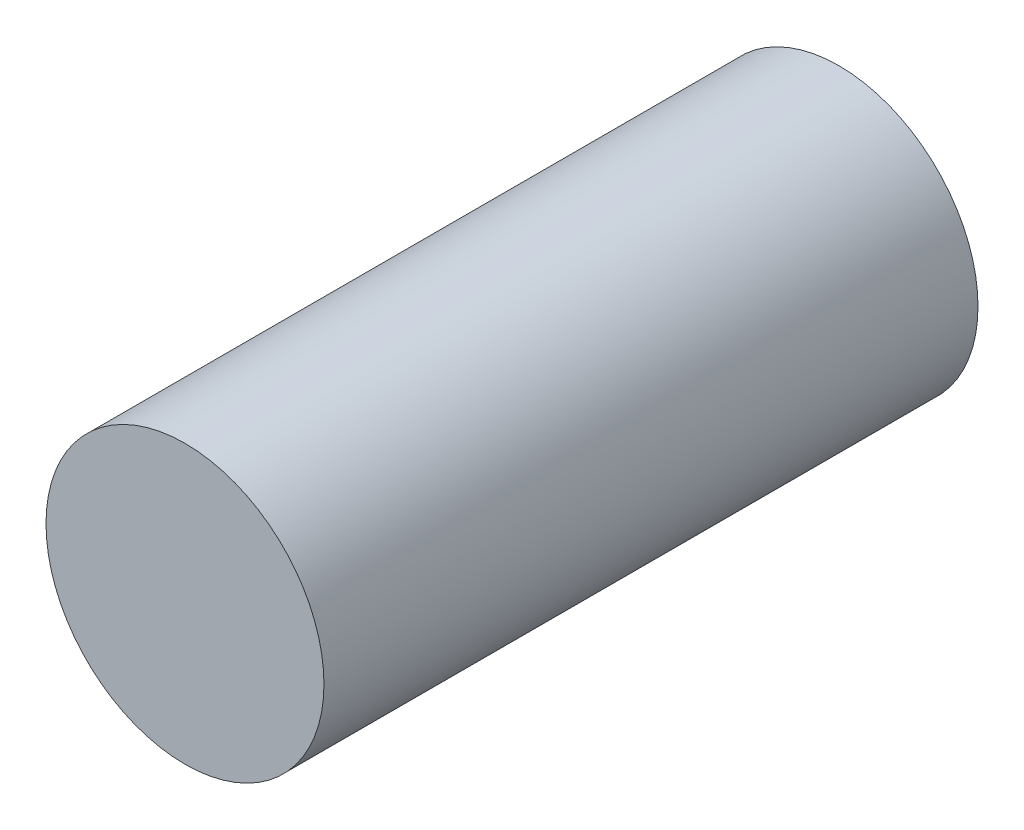
ISO-10303-21;
HEADER;
FILE_DESCRIPTION(('STEP AP214'),'2;1');
FILE_NAME('part.step','',(''),(''),'','','');
FILE_SCHEMA(('AUTOMOTIVE_DESIGN { 1 0 10303 214 1 1 1 1 }'));
ENDSEC;
DATA;
#1=APPLICATION_CONTEXT('core data for automotive mechanical design processes');
#2=APPLICATION_PROTOCOL_DEFINITION('international standard','automotive_design',2000,#1);
#3=PRODUCT_CONTEXT('',#1,'mechanical');
#4=PRODUCT('Part','Part','',(#3));
#5=PRODUCT_RELATED_PRODUCT_CATEGORY('part','',(#4));
#6=PRODUCT_DEFINITION_FORMATION('','',#4);
#7=PRODUCT_DEFINITION_CONTEXT('part definition',#1,'design');
#8=PRODUCT_DEFINITION('design','',#6,#7);
#9=PRODUCT_DEFINITION_SHAPE('','',#8);
#10=(LENGTH_UNIT() NAMED_UNIT(*) SI_UNIT(.MILLI.,.METRE.));
#11=(NAMED_UNIT(*) PLANE_ANGLE_UNIT() SI_UNIT($,.RADIAN.));
#12=(NAMED_UNIT(*) SI_UNIT($,.STERADIAN.) SOLID_ANGLE_UNIT());
#13=UNCERTAINTY_MEASURE_WITH_UNIT(LENGTH_MEASURE(1.E-05),#10,'distance_accuracy_value','');
#14=(GEOMETRIC_REPRESENTATION_CONTEXT(3) GLOBAL_UNCERTAINTY_ASSIGNED_CONTEXT((#13)) GLOBAL_UNIT_ASSIGNED_CONTEXT((#10,
#11,#12)) REPRESENTATION_CONTEXT('',''));
#15=CARTESIAN_POINT('',(0.,0.,0.));
#16=DIRECTION('',(0.,0.,1.));
#17=DIRECTION('',(1.,0.,0.));
#18=AXIS2_PLACEMENT_3D('',#15,#16,#17);
#19=CARTESIAN_POINT('',(0.,0.,0.));
#20=DIRECTION('',(0.,0.,1.));
#21=DIRECTION('',(1.,0.,0.));
#22=AXIS2_PLACEMENT_3D('',#19,#20,#21);
#23=PLANE('',#22);
#24=CARTESIAN_POINT('',(0.,0.,0.));
#25=DIRECTION('',(0.,0.,1.));
#26=DIRECTION('',(1.,0.,0.));
#27=AXIS2_PLACEMENT_3D('',#24,#25,#26);
#28=CIRCLE('',#27,5.1);
#29=CARTESIAN_POINT('',(5.1,0.,0.));
#30=VERTEX_POINT('',#29);
#31=EDGE_CURVE('E11',#30,#30,#28,.T.);
#32=ORIENTED_EDGE('',*,*,#31,.F.);
#33=EDGE_LOOP('',(#32));
#34=FACE_BOUND('',#33,.T.);
#35=ADVANCED_FACE('F40',(#34),#23,.F.);
#36=CARTESIAN_POINT('',(0.,0.,0.));
#37=DIRECTION('',(0.,0.,1.));
#38=DIRECTION('',(1.,0.,0.));
#39=AXIS2_PLACEMENT_3D('',#36,#37,#38);
#40=CYLINDRICAL_SURFACE('',#39,5.1);
#41=ORIENTED_EDGE('',*,*,#31,.T.);
#42=EDGE_LOOP('',(#41));
#43=FACE_BOUND('',#42,.T.);
#44=CARTESIAN_POINT('',(0.,0.,24.));
#45=DIRECTION('',(0.,0.,1.));
#46=DIRECTION('',(1.,0.,0.));
#47=AXIS2_PLACEMENT_3D('',#44,#45,#46);
#48=CIRCLE('',#47,5.1);
#49=CARTESIAN_POINT('',(5.1,0.,24.));
#50=VERTEX_POINT('',#49);
#51=EDGE_CURVE('E43',#50,#50,#48,.T.);
#52=ORIENTED_EDGE('',*,*,#51,.F.);
#53=EDGE_LOOP('',(#52));
#54=FACE_BOUND('',#53,.T.);
#55=ADVANCED_FACE('F54',(#43,#54),#40,.T.);
#56=CARTESIAN_POINT('',(0.,0.,24.));
#57=DIRECTION('',(0.,0.,1.));
#58=DIRECTION('',(1.,0.,0.));
#59=AXIS2_PLACEMENT_3D('',#56,#57,#58);
#60=PLANE('',#59);
#61=ORIENTED_EDGE('',*,*,#51,.T.);
#62=EDGE_LOOP('',(#61));
#63=FACE_BOUND('',#62,.T.);
#64=ADVANCED_FACE('F52',(#63),#60,.T.);
#65=CLOSED_SHELL('',(#35,#55,#64));
#66=MANIFOLD_SOLID_BREP('B2',#65);
#67=ADVANCED_BREP_SHAPE_REPRESENTATION('',(#18,#66),#14);
#68=SHAPE_DEFINITION_REPRESENTATION(#9,#67);
ENDSEC;
END-ISO-10303-21;
